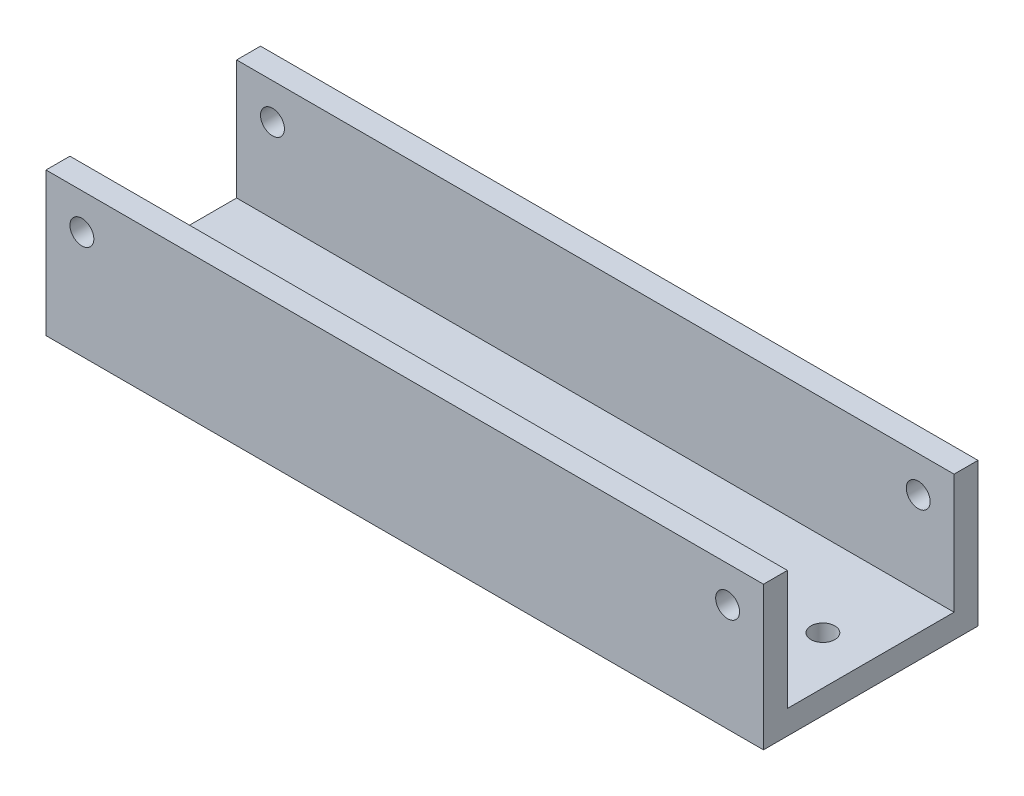
ISO-10303-21;
HEADER;
FILE_DESCRIPTION(('STEP AP214'),'2;1');
FILE_NAME('part.step','',(''),(''),'','','');
FILE_SCHEMA(('AUTOMOTIVE_DESIGN { 1 0 10303 214 1 1 1 1 }'));
ENDSEC;
DATA;
#1=APPLICATION_CONTEXT('core data for automotive mechanical design processes');
#2=APPLICATION_PROTOCOL_DEFINITION('international standard','automotive_design',2000,#1);
#3=PRODUCT_CONTEXT('',#1,'mechanical');
#4=PRODUCT('Part','Part','',(#3));
#5=PRODUCT_RELATED_PRODUCT_CATEGORY('part','',(#4));
#6=PRODUCT_DEFINITION_FORMATION('','',#4);
#7=PRODUCT_DEFINITION_CONTEXT('part definition',#1,'design');
#8=PRODUCT_DEFINITION('design','',#6,#7);
#9=PRODUCT_DEFINITION_SHAPE('','',#8);
#10=(LENGTH_UNIT() NAMED_UNIT(*) SI_UNIT(.MILLI.,.METRE.));
#11=(NAMED_UNIT(*) PLANE_ANGLE_UNIT() SI_UNIT($,.RADIAN.));
#12=(NAMED_UNIT(*) SI_UNIT($,.STERADIAN.) SOLID_ANGLE_UNIT());
#13=UNCERTAINTY_MEASURE_WITH_UNIT(LENGTH_MEASURE(1.E-05),#10,'distance_accuracy_value','');
#14=(GEOMETRIC_REPRESENTATION_CONTEXT(3) GLOBAL_UNCERTAINTY_ASSIGNED_CONTEXT((#13)) GLOBAL_UNIT_ASSIGNED_CONTEXT((#10,
#11,#12)) REPRESENTATION_CONTEXT('',''));
#15=CARTESIAN_POINT('',(0.,0.,0.));
#16=DIRECTION('',(0.,0.,1.));
#17=DIRECTION('',(1.,0.,0.));
#18=AXIS2_PLACEMENT_3D('',#15,#16,#17);
#19=CARTESIAN_POINT('',(0.,3.,0.));
#20=DIRECTION('',(0.,1.,0.));
#21=DIRECTION('',(0.,0.,1.));
#22=AXIS2_PLACEMENT_3D('',#19,#20,#21);
#23=PLANE('',#22);
#24=CARTESIAN_POINT('',(-140.,3.,-20.425));
#25=DIRECTION('',(0.,1.,0.));
#26=DIRECTION('',(0.,0.,1.));
#27=AXIS2_PLACEMENT_3D('',#24,#25,#26);
#28=CIRCLE('',#27,2.5);
#29=CARTESIAN_POINT('',(-140.,3.,-17.925));
#30=VERTEX_POINT('',#29);
#31=EDGE_CURVE('E171',#30,#30,#28,.T.);
#32=ORIENTED_EDGE('',*,*,#31,.F.);
#33=EDGE_LOOP('',(#32));
#34=FACE_BOUND('',#33,.T.);
#35=CARTESIAN_POINT('',(-10.,3.,-20.425));
#36=DIRECTION('',(0.,1.,0.));
#37=DIRECTION('',(0.,0.,1.));
#38=AXIS2_PLACEMENT_3D('',#35,#36,#37);
#39=CIRCLE('',#38,2.5);
#40=CARTESIAN_POINT('',(-10.,3.,-17.925));
#41=VERTEX_POINT('',#40);
#42=EDGE_CURVE('E175',#41,#41,#39,.T.);
#43=ORIENTED_EDGE('',*,*,#42,.F.);
#44=EDGE_LOOP('',(#43));
#45=FACE_BOUND('',#44,.T.);
#46=DIRECTION('',(0.,0.,1.));
#47=VECTOR('',#46,1.);
#48=CARTESIAN_POINT('',(-150.,3.,0.));
#49=LINE('',#48,#47);
#50=CARTESIAN_POINT('',(-150.,3.,-37.85));
#51=VERTEX_POINT('',#50);
#52=CARTESIAN_POINT('',(-150.,3.,-2.99999999999998));
#53=VERTEX_POINT('',#52);
#54=EDGE_CURVE('E11',#51,#53,#49,.T.);
#55=ORIENTED_EDGE('',*,*,#54,.T.);
#56=DIRECTION('',(-1.,0.,0.));
#57=VECTOR('',#56,1.);
#58=CARTESIAN_POINT('',(0.,3.,-3.));
#59=LINE('',#58,#57);
#60=CARTESIAN_POINT('',(0.,3.,-2.99999999999999));
#61=VERTEX_POINT('',#60);
#62=EDGE_CURVE('E57',#61,#53,#59,.T.);
#63=ORIENTED_EDGE('',*,*,#62,.F.);
#64=DIRECTION('',(0.,0.,-1.));
#65=VECTOR('',#64,1.);
#66=CARTESIAN_POINT('',(0.,3.,0.));
#67=LINE('',#66,#65);
#68=CARTESIAN_POINT('',(0.,3.,-37.85));
#69=VERTEX_POINT('',#68);
#70=EDGE_CURVE('E50',#61,#69,#67,.T.);
#71=ORIENTED_EDGE('',*,*,#70,.T.);
#72=DIRECTION('',(1.,0.,0.));
#73=VECTOR('',#72,1.);
#74=CARTESIAN_POINT('',(-150.,3.,-37.85));
#75=LINE('',#74,#73);
#76=EDGE_CURVE('E152',#51,#69,#75,.T.);
#77=ORIENTED_EDGE('',*,*,#76,.F.);
#78=EDGE_LOOP('',(#55,#63,#71,#77));
#79=FACE_BOUND('',#78,.T.);
#80=ADVANCED_FACE('F41',(#34,#45,#79),#23,.T.);
#81=CARTESIAN_POINT('',(0.,3.,0.));
#82=DIRECTION('',(-1.,0.,0.));
#83=DIRECTION('',(0.,0.,1.));
#84=AXIS2_PLACEMENT_3D('',#81,#82,#83);
#85=PLANE('',#84);
#86=DIRECTION('',(0.,0.,-1.));
#87=VECTOR('',#86,1.);
#88=CARTESIAN_POINT('',(0.,28.,0.));
#89=LINE('',#88,#87);
#90=CARTESIAN_POINT('',(0.,28.,2.));
#91=VERTEX_POINT('',#90);
#92=CARTESIAN_POINT('',(0.,28.,-3.));
#93=VERTEX_POINT('',#92);
#94=EDGE_CURVE('E105',#91,#93,#89,.T.);
#95=ORIENTED_EDGE('',*,*,#94,.F.);
#96=DIRECTION('',(0.,-1.,0.));
#97=VECTOR('',#96,1.);
#98=CARTESIAN_POINT('',(0.,28.,2.));
#99=LINE('',#98,#97);
#100=CARTESIAN_POINT('',(0.,-1.99999999999999,2.));
#101=VERTEX_POINT('',#100);
#102=EDGE_CURVE('E109',#91,#101,#99,.T.);
#103=ORIENTED_EDGE('',*,*,#102,.T.);
#104=DIRECTION('',(0.,0.,-1.));
#105=VECTOR('',#104,1.);
#106=CARTESIAN_POINT('',(0.,-1.99999999999999,2.));
#107=LINE('',#106,#105);
#108=CARTESIAN_POINT('',(0.,-2.,-42.85));
#109=VERTEX_POINT('',#108);
#110=EDGE_CURVE('E129',#101,#109,#107,.T.);
#111=ORIENTED_EDGE('',*,*,#110,.T.);
#112=DIRECTION('',(0.,1.,0.));
#113=VECTOR('',#112,1.);
#114=CARTESIAN_POINT('',(0.,-2.,-42.85));
#115=LINE('',#114,#113);
#116=CARTESIAN_POINT('',(0.,28.,-42.85));
#117=VERTEX_POINT('',#116);
#118=EDGE_CURVE('E124',#109,#117,#115,.T.);
#119=ORIENTED_EDGE('',*,*,#118,.T.);
#120=DIRECTION('',(0.,0.,-1.));
#121=VECTOR('',#120,1.);
#122=CARTESIAN_POINT('',(0.,28.,-40.85));
#123=LINE('',#122,#121);
#124=CARTESIAN_POINT('',(0.,28.,-37.85));
#125=VERTEX_POINT('',#124);
#126=EDGE_CURVE('E160',#125,#117,#123,.T.);
#127=ORIENTED_EDGE('',*,*,#126,.F.);
#128=DIRECTION('',(0.,-1.,0.));
#129=VECTOR('',#128,1.);
#130=CARTESIAN_POINT('',(0.,28.,-37.85));
#131=LINE('',#130,#129);
#132=EDGE_CURVE('E162',#125,#69,#131,.T.);
#133=ORIENTED_EDGE('',*,*,#132,.T.);
#134=ORIENTED_EDGE('',*,*,#70,.F.);
#135=DIRECTION('',(0.,-1.,0.));
#136=VECTOR('',#135,1.);
#137=CARTESIAN_POINT('',(0.,28.,-3.));
#138=LINE('',#137,#136);
#139=EDGE_CURVE('E111',#93,#61,#138,.T.);
#140=ORIENTED_EDGE('',*,*,#139,.F.);
#141=EDGE_LOOP('',(#95,#103,#111,#119,#127,#133,#134,#140));
#142=FACE_BOUND('',#141,.T.);
#143=ADVANCED_FACE('F43',(#142),#85,.F.);
#144=CARTESIAN_POINT('',(-150.,3.,0.));
#145=DIRECTION('',(1.,0.,0.));
#146=DIRECTION('',(0.,0.,-1.));
#147=AXIS2_PLACEMENT_3D('',#144,#145,#146);
#148=PLANE('',#147);
#149=DIRECTION('',(0.,0.,1.));
#150=VECTOR('',#149,1.);
#151=CARTESIAN_POINT('',(-150.,28.,-40.85));
#152=LINE('',#151,#150);
#153=CARTESIAN_POINT('',(-150.,28.,-42.85));
#154=VERTEX_POINT('',#153);
#155=CARTESIAN_POINT('',(-150.,28.,-37.85));
#156=VERTEX_POINT('',#155);
#157=EDGE_CURVE('E155',#154,#156,#152,.T.);
#158=ORIENTED_EDGE('',*,*,#157,.F.);
#159=DIRECTION('',(0.,-1.,0.));
#160=VECTOR('',#159,1.);
#161=CARTESIAN_POINT('',(-150.,-2.,-42.85));
#162=LINE('',#161,#160);
#163=CARTESIAN_POINT('',(-150.,-2.,-42.85));
#164=VERTEX_POINT('',#163);
#165=EDGE_CURVE('E135',#154,#164,#162,.T.);
#166=ORIENTED_EDGE('',*,*,#165,.T.);
#167=DIRECTION('',(0.,0.,1.));
#168=VECTOR('',#167,1.);
#169=CARTESIAN_POINT('',(-150.,-1.99999999999999,2.));
#170=LINE('',#169,#168);
#171=CARTESIAN_POINT('',(-150.,-1.99999999999999,2.));
#172=VERTEX_POINT('',#171);
#173=EDGE_CURVE('E185',#164,#172,#170,.T.);
#174=ORIENTED_EDGE('',*,*,#173,.T.);
#175=DIRECTION('',(0.,1.,0.));
#176=VECTOR('',#175,1.);
#177=CARTESIAN_POINT('',(-150.,28.,2.));
#178=LINE('',#177,#176);
#179=CARTESIAN_POINT('',(-150.,28.,2.));
#180=VERTEX_POINT('',#179);
#181=EDGE_CURVE('E143',#172,#180,#178,.T.);
#182=ORIENTED_EDGE('',*,*,#181,.T.);
#183=DIRECTION('',(0.,0.,1.));
#184=VECTOR('',#183,1.);
#185=CARTESIAN_POINT('',(-150.,28.,0.));
#186=LINE('',#185,#184);
#187=CARTESIAN_POINT('',(-150.,28.,-2.99999999999998));
#188=VERTEX_POINT('',#187);
#189=EDGE_CURVE('E119',#188,#180,#186,.T.);
#190=ORIENTED_EDGE('',*,*,#189,.F.);
#191=DIRECTION('',(0.,-1.,0.));
#192=VECTOR('',#191,1.);
#193=CARTESIAN_POINT('',(-150.,28.,-2.99999999999998));
#194=LINE('',#193,#192);
#195=EDGE_CURVE('E148',#188,#53,#194,.T.);
#196=ORIENTED_EDGE('',*,*,#195,.T.);
#197=ORIENTED_EDGE('',*,*,#54,.F.);
#198=DIRECTION('',(0.,-1.,0.));
#199=VECTOR('',#198,1.);
#200=CARTESIAN_POINT('',(-150.,28.,-37.85));
#201=LINE('',#200,#199);
#202=EDGE_CURVE('E167',#156,#51,#201,.T.);
#203=ORIENTED_EDGE('',*,*,#202,.F.);
#204=EDGE_LOOP('',(#158,#166,#174,#182,#190,#196,#197,#203));
#205=FACE_BOUND('',#204,.T.);
#206=ADVANCED_FACE('F189',(#205),#148,.F.);
#207=CARTESIAN_POINT('',(-150.,28.,-37.85));
#208=DIRECTION('',(0.,0.,-1.));
#209=DIRECTION('',(-1.,0.,0.));
#210=AXIS2_PLACEMENT_3D('',#207,#208,#209);
#211=PLANE('',#210);
#212=CARTESIAN_POINT('',(-142.5,20.5,-37.85));
#213=DIRECTION('',(0.,0.,-1.));
#214=DIRECTION('',(-1.,0.,0.));
#215=AXIS2_PLACEMENT_3D('',#212,#213,#214);
#216=CIRCLE('',#215,2.5);
#217=CARTESIAN_POINT('',(-145.,20.5,-37.85));
#218=VERTEX_POINT('',#217);
#219=EDGE_CURVE('E180',#218,#218,#216,.T.);
#220=ORIENTED_EDGE('',*,*,#219,.T.);
#221=EDGE_LOOP('',(#220));
#222=FACE_BOUND('',#221,.T.);
#223=CARTESIAN_POINT('',(-7.5,20.5,-37.85));
#224=DIRECTION('',(0.,0.,-1.));
#225=DIRECTION('',(-1.,0.,0.));
#226=AXIS2_PLACEMENT_3D('',#223,#224,#225);
#227=CIRCLE('',#226,2.5);
#228=CARTESIAN_POINT('',(-10.,20.5,-37.85));
#229=VERTEX_POINT('',#228);
#230=EDGE_CURVE('E239',#229,#229,#227,.T.);
#231=ORIENTED_EDGE('',*,*,#230,.T.);
#232=EDGE_LOOP('',(#231));
#233=FACE_BOUND('',#232,.T.);
#234=ORIENTED_EDGE('',*,*,#76,.T.);
#235=ORIENTED_EDGE('',*,*,#132,.F.);
#236=DIRECTION('',(1.,0.,0.));
#237=VECTOR('',#236,1.);
#238=CARTESIAN_POINT('',(-150.,28.,-37.85));
#239=LINE('',#238,#237);
#240=EDGE_CURVE('E158',#156,#125,#239,.T.);
#241=ORIENTED_EDGE('',*,*,#240,.F.);
#242=ORIENTED_EDGE('',*,*,#202,.T.);
#243=EDGE_LOOP('',(#234,#235,#241,#242));
#244=FACE_BOUND('',#243,.T.);
#245=ADVANCED_FACE('F203',(#222,#233,#244),#211,.F.);
#246=CARTESIAN_POINT('',(0.,28.,0.));
#247=DIRECTION('',(0.,1.,0.));
#248=DIRECTION('',(0.,0.,1.));
#249=AXIS2_PLACEMENT_3D('',#246,#247,#248);
#250=PLANE('',#249);
#251=ORIENTED_EDGE('',*,*,#157,.T.);
#252=ORIENTED_EDGE('',*,*,#240,.T.);
#253=ORIENTED_EDGE('',*,*,#126,.T.);
#254=DIRECTION('',(1.,0.,0.));
#255=VECTOR('',#254,1.);
#256=CARTESIAN_POINT('',(-203.958525739683,28.,-42.85));
#257=LINE('',#256,#255);
#258=EDGE_CURVE('E140',#154,#117,#257,.T.);
#259=ORIENTED_EDGE('',*,*,#258,.F.);
#260=EDGE_LOOP('',(#251,#252,#253,#259));
#261=FACE_BOUND('',#260,.T.);
#262=ADVANCED_FACE('F201',(#261),#250,.T.);
#263=CARTESIAN_POINT('',(0.,28.,-3.));
#264=DIRECTION('',(0.,0.,1.));
#265=DIRECTION('',(1.,0.,0.));
#266=AXIS2_PLACEMENT_3D('',#263,#264,#265);
#267=PLANE('',#266);
#268=CARTESIAN_POINT('',(-142.5,20.5,-2.99999999999999));
#269=DIRECTION('',(0.,0.,1.));
#270=DIRECTION('',(1.,0.,0.));
#271=AXIS2_PLACEMENT_3D('',#268,#269,#270);
#272=CIRCLE('',#271,2.5);
#273=CARTESIAN_POINT('',(-140.,20.5,-2.99999999999999));
#274=VERTEX_POINT('',#273);
#275=EDGE_CURVE('E241',#274,#274,#272,.T.);
#276=ORIENTED_EDGE('',*,*,#275,.T.);
#277=EDGE_LOOP('',(#276));
#278=FACE_BOUND('',#277,.T.);
#279=CARTESIAN_POINT('',(-7.5,20.5,-3.));
#280=DIRECTION('',(0.,0.,1.));
#281=DIRECTION('',(1.,0.,0.));
#282=AXIS2_PLACEMENT_3D('',#279,#280,#281);
#283=CIRCLE('',#282,2.5);
#284=CARTESIAN_POINT('',(-5.,20.5,-3.));
#285=VERTEX_POINT('',#284);
#286=EDGE_CURVE('E242',#285,#285,#283,.T.);
#287=ORIENTED_EDGE('',*,*,#286,.T.);
#288=EDGE_LOOP('',(#287));
#289=FACE_BOUND('',#288,.T.);
#290=ORIENTED_EDGE('',*,*,#62,.T.);
#291=ORIENTED_EDGE('',*,*,#195,.F.);
#292=DIRECTION('',(-1.,0.,0.));
#293=VECTOR('',#292,1.);
#294=CARTESIAN_POINT('',(0.,28.,-3.));
#295=LINE('',#294,#293);
#296=EDGE_CURVE('E113',#93,#188,#295,.T.);
#297=ORIENTED_EDGE('',*,*,#296,.F.);
#298=ORIENTED_EDGE('',*,*,#139,.T.);
#299=EDGE_LOOP('',(#290,#291,#297,#298));
#300=FACE_BOUND('',#299,.T.);
#301=ADVANCED_FACE('F206',(#278,#289,#300),#267,.F.);
#302=CARTESIAN_POINT('',(0.,28.,0.));
#303=DIRECTION('',(0.,1.,0.));
#304=DIRECTION('',(0.,0.,1.));
#305=AXIS2_PLACEMENT_3D('',#302,#303,#304);
#306=PLANE('',#305);
#307=ORIENTED_EDGE('',*,*,#94,.T.);
#308=ORIENTED_EDGE('',*,*,#296,.T.);
#309=ORIENTED_EDGE('',*,*,#189,.T.);
#310=DIRECTION('',(1.,0.,0.));
#311=VECTOR('',#310,1.);
#312=CARTESIAN_POINT('',(-203.958525739683,28.,2.));
#313=LINE('',#312,#311);
#314=EDGE_CURVE('E116',#180,#91,#313,.T.);
#315=ORIENTED_EDGE('',*,*,#314,.T.);
#316=EDGE_LOOP('',(#307,#308,#309,#315));
#317=FACE_BOUND('',#316,.T.);
#318=ADVANCED_FACE('F117',(#317),#306,.T.);
#319=CARTESIAN_POINT('',(-203.958525739683,-2.,-42.85));
#320=DIRECTION('',(0.,0.,-1.));
#321=DIRECTION('',(-1.,0.,0.));
#322=AXIS2_PLACEMENT_3D('',#319,#320,#321);
#323=PLANE('',#322);
#324=CARTESIAN_POINT('',(-142.5,20.5,-42.85));
#325=DIRECTION('',(0.,0.,1.));
#326=DIRECTION('',(1.,0.,0.));
#327=AXIS2_PLACEMENT_3D('',#324,#325,#326);
#328=CIRCLE('',#327,2.5);
#329=CARTESIAN_POINT('',(-140.,20.5,-42.85));
#330=VERTEX_POINT('',#329);
#331=EDGE_CURVE('E245',#330,#330,#328,.T.);
#332=ORIENTED_EDGE('',*,*,#331,.T.);
#333=EDGE_LOOP('',(#332));
#334=FACE_BOUND('',#333,.T.);
#335=CARTESIAN_POINT('',(-7.5,20.5,-42.85));
#336=DIRECTION('',(0.,0.,1.));
#337=DIRECTION('',(1.,0.,0.));
#338=AXIS2_PLACEMENT_3D('',#335,#336,#337);
#339=CIRCLE('',#338,2.5);
#340=CARTESIAN_POINT('',(-5.,20.5,-42.85));
#341=VERTEX_POINT('',#340);
#342=EDGE_CURVE('E248',#341,#341,#339,.T.);
#343=ORIENTED_EDGE('',*,*,#342,.T.);
#344=EDGE_LOOP('',(#343));
#345=FACE_BOUND('',#344,.T.);
#346=ORIENTED_EDGE('',*,*,#165,.F.);
#347=ORIENTED_EDGE('',*,*,#258,.T.);
#348=ORIENTED_EDGE('',*,*,#118,.F.);
#349=DIRECTION('',(1.,0.,0.));
#350=VECTOR('',#349,1.);
#351=CARTESIAN_POINT('',(-203.958525739683,-2.,-42.85));
#352=LINE('',#351,#350);
#353=EDGE_CURVE('E144',#164,#109,#352,.T.);
#354=ORIENTED_EDGE('',*,*,#353,.F.);
#355=EDGE_LOOP('',(#346,#347,#348,#354));
#356=FACE_BOUND('',#355,.T.);
#357=ADVANCED_FACE('F197',(#334,#345,#356),#323,.T.);
#358=CARTESIAN_POINT('',(-203.958525739683,-1.99999999999999,2.));
#359=DIRECTION('',(0.,-1.,0.));
#360=DIRECTION('',(0.,0.,-1.));
#361=AXIS2_PLACEMENT_3D('',#358,#359,#360);
#362=PLANE('',#361);
#363=CARTESIAN_POINT('',(-140.,-2.,-20.425));
#364=DIRECTION('',(0.,-1.,0.));
#365=DIRECTION('',(0.,0.,-1.));
#366=AXIS2_PLACEMENT_3D('',#363,#364,#365);
#367=CIRCLE('',#366,2.5);
#368=CARTESIAN_POINT('',(-140.,-2.,-22.925));
#369=VERTEX_POINT('',#368);
#370=EDGE_CURVE('E45',#369,#369,#367,.T.);
#371=ORIENTED_EDGE('',*,*,#370,.F.);
#372=EDGE_LOOP('',(#371));
#373=FACE_BOUND('',#372,.T.);
#374=CARTESIAN_POINT('',(-10.,-2.,-20.425));
#375=DIRECTION('',(0.,-1.,0.));
#376=DIRECTION('',(0.,0.,-1.));
#377=AXIS2_PLACEMENT_3D('',#374,#375,#376);
#378=CIRCLE('',#377,2.5);
#379=CARTESIAN_POINT('',(-10.,-2.,-22.925));
#380=VERTEX_POINT('',#379);
#381=EDGE_CURVE('E133',#380,#380,#378,.T.);
#382=ORIENTED_EDGE('',*,*,#381,.F.);
#383=EDGE_LOOP('',(#382));
#384=FACE_BOUND('',#383,.T.);
#385=ORIENTED_EDGE('',*,*,#173,.F.);
#386=ORIENTED_EDGE('',*,*,#353,.T.);
#387=ORIENTED_EDGE('',*,*,#110,.F.);
#388=DIRECTION('',(1.,0.,0.));
#389=VECTOR('',#388,1.);
#390=CARTESIAN_POINT('',(-203.958525739683,-1.99999999999999,2.));
#391=LINE('',#390,#389);
#392=EDGE_CURVE('E123',#172,#101,#391,.T.);
#393=ORIENTED_EDGE('',*,*,#392,.F.);
#394=EDGE_LOOP('',(#385,#386,#387,#393));
#395=FACE_BOUND('',#394,.T.);
#396=ADVANCED_FACE('F195',(#373,#384,#395),#362,.T.);
#397=CARTESIAN_POINT('',(-203.958525739683,28.,2.));
#398=DIRECTION('',(0.,0.,1.));
#399=DIRECTION('',(0.,-1.,0.));
#400=AXIS2_PLACEMENT_3D('',#397,#398,#399);
#401=PLANE('',#400);
#402=CARTESIAN_POINT('',(-142.5,20.5,2.));
#403=DIRECTION('',(0.,0.,1.));
#404=DIRECTION('',(1.,0.,0.));
#405=AXIS2_PLACEMENT_3D('',#402,#403,#404);
#406=CIRCLE('',#405,2.5);
#407=CARTESIAN_POINT('',(-140.,20.5,2.));
#408=VERTEX_POINT('',#407);
#409=EDGE_CURVE('E254',#408,#408,#406,.T.);
#410=ORIENTED_EDGE('',*,*,#409,.F.);
#411=EDGE_LOOP('',(#410));
#412=FACE_BOUND('',#411,.T.);
#413=CARTESIAN_POINT('',(-7.5,20.5,2.));
#414=DIRECTION('',(0.,0.,1.));
#415=DIRECTION('',(1.,0.,0.));
#416=AXIS2_PLACEMENT_3D('',#413,#414,#415);
#417=CIRCLE('',#416,2.5);
#418=CARTESIAN_POINT('',(-5.,20.5,2.));
#419=VERTEX_POINT('',#418);
#420=EDGE_CURVE('E251',#419,#419,#417,.T.);
#421=ORIENTED_EDGE('',*,*,#420,.F.);
#422=EDGE_LOOP('',(#421));
#423=FACE_BOUND('',#422,.T.);
#424=ORIENTED_EDGE('',*,*,#181,.F.);
#425=ORIENTED_EDGE('',*,*,#392,.T.);
#426=ORIENTED_EDGE('',*,*,#102,.F.);
#427=ORIENTED_EDGE('',*,*,#314,.F.);
#428=EDGE_LOOP('',(#424,#425,#426,#427));
#429=FACE_BOUND('',#428,.T.);
#430=ADVANCED_FACE('F126',(#412,#423,#429),#401,.T.);
#431=CARTESIAN_POINT('',(-10.,-7.,-20.425));
#432=DIRECTION('',(0.,1.,0.));
#433=DIRECTION('',(0.,0.,1.));
#434=AXIS2_PLACEMENT_3D('',#431,#432,#433);
#435=CYLINDRICAL_SURFACE('',#434,2.5);
#436=ORIENTED_EDGE('',*,*,#381,.T.);
#437=EDGE_LOOP('',(#436));
#438=FACE_BOUND('',#437,.T.);
#439=ORIENTED_EDGE('',*,*,#42,.T.);
#440=EDGE_LOOP('',(#439));
#441=FACE_BOUND('',#440,.T.);
#442=ADVANCED_FACE('F287',(#438,#441),#435,.F.);
#443=CARTESIAN_POINT('',(-140.,-7.,-20.425));
#444=DIRECTION('',(0.,1.,0.));
#445=DIRECTION('',(0.,0.,1.));
#446=AXIS2_PLACEMENT_3D('',#443,#444,#445);
#447=CYLINDRICAL_SURFACE('',#446,2.5);
#448=ORIENTED_EDGE('',*,*,#370,.T.);
#449=EDGE_LOOP('',(#448));
#450=FACE_BOUND('',#449,.T.);
#451=ORIENTED_EDGE('',*,*,#31,.T.);
#452=EDGE_LOOP('',(#451));
#453=FACE_BOUND('',#452,.T.);
#454=ADVANCED_FACE('F279',(#450,#453),#447,.F.);
#455=CARTESIAN_POINT('',(-7.5,20.5,-42.85));
#456=DIRECTION('',(0.,0.,1.));
#457=DIRECTION('',(1.,0.,0.));
#458=AXIS2_PLACEMENT_3D('',#455,#456,#457);
#459=CYLINDRICAL_SURFACE('',#458,2.5);
#460=ORIENTED_EDGE('',*,*,#420,.T.);
#461=EDGE_LOOP('',(#460));
#462=FACE_BOUND('',#461,.T.);
#463=ORIENTED_EDGE('',*,*,#286,.F.);
#464=EDGE_LOOP('',(#463));
#465=FACE_BOUND('',#464,.T.);
#466=ADVANCED_FACE('F273',(#462,#465),#459,.F.);
#467=CARTESIAN_POINT('',(-142.5,20.5,-42.85));
#468=DIRECTION('',(0.,0.,1.));
#469=DIRECTION('',(1.,0.,0.));
#470=AXIS2_PLACEMENT_3D('',#467,#468,#469);
#471=CYLINDRICAL_SURFACE('',#470,2.5);
#472=ORIENTED_EDGE('',*,*,#409,.T.);
#473=EDGE_LOOP('',(#472));
#474=FACE_BOUND('',#473,.T.);
#475=ORIENTED_EDGE('',*,*,#275,.F.);
#476=EDGE_LOOP('',(#475));
#477=FACE_BOUND('',#476,.T.);
#478=ADVANCED_FACE('F267',(#474,#477),#471,.F.);
#479=ORIENTED_EDGE('',*,*,#342,.F.);
#480=EDGE_LOOP('',(#479));
#481=FACE_BOUND('',#480,.T.);
#482=ORIENTED_EDGE('',*,*,#230,.F.);
#483=EDGE_LOOP('',(#482));
#484=FACE_BOUND('',#483,.T.);
#485=ADVANCED_FACE('F265',(#481,#484),#459,.F.);
#486=ORIENTED_EDGE('',*,*,#331,.F.);
#487=EDGE_LOOP('',(#486));
#488=FACE_BOUND('',#487,.T.);
#489=ORIENTED_EDGE('',*,*,#219,.F.);
#490=EDGE_LOOP('',(#489));
#491=FACE_BOUND('',#490,.T.);
#492=ADVANCED_FACE('F262',(#488,#491),#471,.F.);
#493=CLOSED_SHELL('',(#80,#143,#206,#245,#262,#301,#318,#357,#396,#430,#442,#454,#466,#478,#485,#492));
#494=MANIFOLD_SOLID_BREP('B2',#493);
#495=ADVANCED_BREP_SHAPE_REPRESENTATION('',(#18,#494),#14);
#496=SHAPE_DEFINITION_REPRESENTATION(#9,#495);
ENDSEC;
END-ISO-10303-21;
